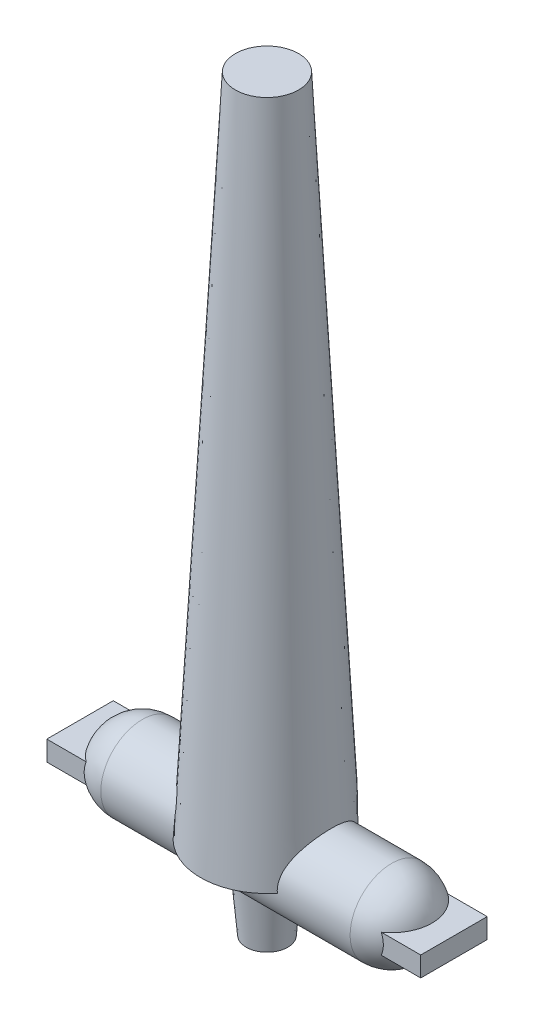
ISO-10303-21;
HEADER;
FILE_DESCRIPTION(('STEP AP214'),'2;1');
FILE_NAME('part.step','',(''),(''),'','','');
FILE_SCHEMA(('AUTOMOTIVE_DESIGN { 1 0 10303 214 1 1 1 1 }'));
ENDSEC;
DATA;
#1=APPLICATION_CONTEXT('core data for automotive mechanical design processes');
#2=APPLICATION_PROTOCOL_DEFINITION('international standard','automotive_design',2000,#1);
#3=PRODUCT_CONTEXT('',#1,'mechanical');
#4=PRODUCT('Part','Part','',(#3));
#5=PRODUCT_RELATED_PRODUCT_CATEGORY('part','',(#4));
#6=PRODUCT_DEFINITION_FORMATION('','',#4);
#7=PRODUCT_DEFINITION_CONTEXT('part definition',#1,'design');
#8=PRODUCT_DEFINITION('design','',#6,#7);
#9=PRODUCT_DEFINITION_SHAPE('','',#8);
#10=(LENGTH_UNIT() NAMED_UNIT(*) SI_UNIT(.MILLI.,.METRE.));
#11=(NAMED_UNIT(*) PLANE_ANGLE_UNIT() SI_UNIT($,.RADIAN.));
#12=(NAMED_UNIT(*) SI_UNIT($,.STERADIAN.) SOLID_ANGLE_UNIT());
#13=UNCERTAINTY_MEASURE_WITH_UNIT(LENGTH_MEASURE(1.E-05),#10,'distance_accuracy_value','');
#14=(GEOMETRIC_REPRESENTATION_CONTEXT(3) GLOBAL_UNCERTAINTY_ASSIGNED_CONTEXT((#13)) GLOBAL_UNIT_ASSIGNED_CONTEXT((#10,
#11,#12)) REPRESENTATION_CONTEXT('',''));
#15=CARTESIAN_POINT('',(0.,0.,0.));
#16=DIRECTION('',(0.,0.,1.));
#17=DIRECTION('',(1.,0.,0.));
#18=AXIS2_PLACEMENT_3D('',#15,#16,#17);
#19=CARTESIAN_POINT('',(-9.525,0.,0.));
#20=DIRECTION('',(1.,0.,0.));
#21=DIRECTION('',(0.,0.,-1.));
#22=AXIS2_PLACEMENT_3D('',#19,#20,#21);
#23=SPHERICAL_SURFACE('',#22,3.175);
#24=CARTESIAN_POINT('',(-9.525,0.,0.));
#25=DIRECTION('',(-1.,0.,0.));
#26=DIRECTION('',(0.,0.,1.));
#27=AXIS2_PLACEMENT_3D('',#24,#25,#26);
#28=CIRCLE('',#27,3.175);
#29=CARTESIAN_POINT('',(-9.525,0.,3.175));
#30=VERTEX_POINT('',#29);
#31=EDGE_CURVE('E254',#30,#30,#28,.F.);
#32=ORIENTED_EDGE('',*,*,#31,.F.);
#33=EDGE_LOOP('',(#32));
#34=FACE_BOUND('',#33,.T.);
#35=CARTESIAN_POINT('',(-9.525,0.762,0.));
#36=DIRECTION('',(0.,-1.,0.));
#37=DIRECTION('',(0.,0.,-1.));
#38=AXIS2_PLACEMENT_3D('',#35,#36,#37);
#39=CIRCLE('',#38,3.08220391927595);
#40=CARTESIAN_POINT('',(-11.2709613397782,0.762,-2.54));
#41=VERTEX_POINT('',#40);
#42=CARTESIAN_POINT('',(-11.2709613397782,0.762,2.54));
#43=VERTEX_POINT('',#42);
#44=EDGE_CURVE('E141',#41,#43,#39,.F.);
#45=ORIENTED_EDGE('',*,*,#44,.T.);
#46=CARTESIAN_POINT('',(-9.525,0.,2.54));
#47=DIRECTION('',(0.,0.,-1.));
#48=DIRECTION('',(-1.,0.,0.));
#49=AXIS2_PLACEMENT_3D('',#46,#47,#48);
#50=CIRCLE('',#49,1.905);
#51=CARTESIAN_POINT('',(-11.2709613397782,-0.762,2.54));
#52=VERTEX_POINT('',#51);
#53=EDGE_CURVE('E155',#43,#52,#50,.F.);
#54=ORIENTED_EDGE('',*,*,#53,.T.);
#55=CARTESIAN_POINT('',(-9.525,-0.762,0.));
#56=DIRECTION('',(0.,1.,0.));
#57=DIRECTION('',(0.,0.,1.));
#58=AXIS2_PLACEMENT_3D('',#55,#56,#57);
#59=CIRCLE('',#58,3.08220391927595);
#60=CARTESIAN_POINT('',(-11.2709613397782,-0.762,-2.54));
#61=VERTEX_POINT('',#60);
#62=EDGE_CURVE('E152',#52,#61,#59,.F.);
#63=ORIENTED_EDGE('',*,*,#62,.T.);
#64=CARTESIAN_POINT('',(-9.525,0.,-2.54));
#65=DIRECTION('',(0.,0.,1.));
#66=DIRECTION('',(1.,0.,0.));
#67=AXIS2_PLACEMENT_3D('',#64,#65,#66);
#68=CIRCLE('',#67,1.905);
#69=EDGE_CURVE('E145',#61,#41,#68,.F.);
#70=ORIENTED_EDGE('',*,*,#69,.T.);
#71=EDGE_LOOP('',(#45,#54,#63,#70));
#72=FACE_BOUND('',#71,.T.);
#73=ADVANCED_FACE('F35',(#34,#72),#23,.T.);
#74=CARTESIAN_POINT('',(9.525,0.,0.));
#75=DIRECTION('',(1.,0.,0.));
#76=DIRECTION('',(0.,0.,-1.));
#77=AXIS2_PLACEMENT_3D('',#74,#75,#76);
#78=SPHERICAL_SURFACE('',#77,3.175);
#79=CARTESIAN_POINT('',(9.525,0.,0.));
#80=DIRECTION('',(-1.,0.,0.));
#81=DIRECTION('',(0.,0.,1.));
#82=AXIS2_PLACEMENT_3D('',#79,#80,#81);
#83=CIRCLE('',#82,3.175);
#84=CARTESIAN_POINT('',(9.525,0.,3.175));
#85=VERTEX_POINT('',#84);
#86=EDGE_CURVE('E252',#85,#85,#83,.T.);
#87=ORIENTED_EDGE('',*,*,#86,.F.);
#88=EDGE_LOOP('',(#87));
#89=FACE_BOUND('',#88,.T.);
#90=CARTESIAN_POINT('',(9.525,-0.762,0.));
#91=DIRECTION('',(0.,1.,0.));
#92=DIRECTION('',(0.,0.,1.));
#93=AXIS2_PLACEMENT_3D('',#90,#91,#92);
#94=CIRCLE('',#93,3.08220391927595);
#95=CARTESIAN_POINT('',(11.2709613397782,-0.762,-2.54));
#96=VERTEX_POINT('',#95);
#97=CARTESIAN_POINT('',(11.2709613397782,-0.762,2.54));
#98=VERTEX_POINT('',#97);
#99=EDGE_CURVE('E49',#96,#98,#94,.F.);
#100=ORIENTED_EDGE('',*,*,#99,.T.);
#101=CARTESIAN_POINT('',(9.525,0.,2.54));
#102=DIRECTION('',(0.,0.,-1.));
#103=DIRECTION('',(-1.,0.,0.));
#104=AXIS2_PLACEMENT_3D('',#101,#102,#103);
#105=CIRCLE('',#104,1.905);
#106=CARTESIAN_POINT('',(11.2709613397782,0.762,2.54));
#107=VERTEX_POINT('',#106);
#108=EDGE_CURVE('E11',#98,#107,#105,.F.);
#109=ORIENTED_EDGE('',*,*,#108,.T.);
#110=CARTESIAN_POINT('',(9.525,0.762,0.));
#111=DIRECTION('',(0.,-1.,0.));
#112=DIRECTION('',(0.,0.,-1.));
#113=AXIS2_PLACEMENT_3D('',#110,#111,#112);
#114=CIRCLE('',#113,3.08220391927595);
#115=CARTESIAN_POINT('',(11.2709613397782,0.762,-2.54));
#116=VERTEX_POINT('',#115);
#117=EDGE_CURVE('E258',#107,#116,#114,.F.);
#118=ORIENTED_EDGE('',*,*,#117,.T.);
#119=CARTESIAN_POINT('',(9.525,0.,-2.54));
#120=DIRECTION('',(0.,0.,1.));
#121=DIRECTION('',(1.,0.,0.));
#122=AXIS2_PLACEMENT_3D('',#119,#120,#121);
#123=CIRCLE('',#122,1.905);
#124=EDGE_CURVE('E263',#116,#96,#123,.F.);
#125=ORIENTED_EDGE('',*,*,#124,.T.);
#126=EDGE_LOOP('',(#100,#109,#118,#125));
#127=FACE_BOUND('',#126,.T.);
#128=ADVANCED_FACE('F226',(#89,#127),#78,.T.);
#129=CARTESIAN_POINT('',(0.,0.,0.));
#130=DIRECTION('',(0.,1.,0.));
#131=DIRECTION('',(-1.,0.,0.));
#132=AXIS2_PLACEMENT_3D('',#129,#130,#131);
#133=PLANE('',#132);
#134=DIRECTION('',(-1.,0.,0.));
#135=VECTOR('',#134,1.);
#136=CARTESIAN_POINT('',(12.7,0.,-3.175));
#137=LINE('',#136,#135);
#138=CARTESIAN_POINT('',(-3.95957058950354,0.,-3.175));
#139=VERTEX_POINT('',#138);
#140=CARTESIAN_POINT('',(3.95957058950355,0.,-3.175));
#141=VERTEX_POINT('',#140);
#142=EDGE_CURVE('E161',#139,#141,#137,.F.);
#143=ORIENTED_EDGE('',*,*,#142,.F.);
#144=CARTESIAN_POINT('',(0.,0.,0.));
#145=DIRECTION('',(0.,1.,0.));
#146=DIRECTION('',(-1.,0.,0.));
#147=AXIS2_PLACEMENT_3D('',#144,#145,#146);
#148=CIRCLE('',#147,5.07531518757815);
#149=EDGE_CURVE('E167',#141,#139,#148,.T.);
#150=ORIENTED_EDGE('',*,*,#149,.F.);
#151=EDGE_LOOP('',(#143,#150));
#152=FACE_BOUND('',#151,.T.);
#153=ADVANCED_FACE('F232',(#152),#133,.F.);
#154=DIRECTION('',(-1.,0.,0.));
#155=VECTOR('',#154,1.);
#156=CARTESIAN_POINT('',(12.7,0.,3.175));
#157=LINE('',#156,#155);
#158=CARTESIAN_POINT('',(3.95957058950355,0.,3.175));
#159=VERTEX_POINT('',#158);
#160=CARTESIAN_POINT('',(-3.95957058950355,0.,3.175));
#161=VERTEX_POINT('',#160);
#162=EDGE_CURVE('E158',#159,#161,#157,.T.);
#163=ORIENTED_EDGE('',*,*,#162,.F.);
#164=EDGE_CURVE('E168',#161,#159,#148,.T.);
#165=ORIENTED_EDGE('',*,*,#164,.F.);
#166=EDGE_LOOP('',(#163,#165));
#167=FACE_BOUND('',#166,.T.);
#168=ADVANCED_FACE('F240',(#167),#133,.F.);
#169=CARTESIAN_POINT('',(0.,0.,0.));
#170=DIRECTION('',(0.,-1.,0.));
#171=DIRECTION('',(1.,0.,0.));
#172=AXIS2_PLACEMENT_3D('',#169,#170,#171);
#173=CONICAL_SURFACE('',#172,5.07531518757815,0.0523598775598232);
#174=CARTESIAN_POINT('',(0.,50.8,0.));
#175=DIRECTION('',(0.,1.,0.));
#176=DIRECTION('',(-1.,0.,0.));
#177=AXIS2_PLACEMENT_3D('',#174,#175,#176);
#178=CIRCLE('',#177,2.413);
#179=CARTESIAN_POINT('',(-2.41300000000001,50.8,0.));
#180=VERTEX_POINT('',#179);
#181=EDGE_CURVE('E164',#180,#180,#178,.T.);
#182=ORIENTED_EDGE('',*,*,#181,.F.);
#183=EDGE_LOOP('',(#182));
#184=FACE_BOUND('',#183,.T.);
#185=CARTESIAN_POINT('',(3.95958402963879,-0.000199999999999678,-3.17499999370079));
#186=CARTESIAN_POINT('',(3.95438967188204,0.0765411431737697,-3.17502304496552));
#187=CARTESIAN_POINT('',(3.95148212424688,0.153428063232889,-3.17222795595932));
#188=CARTESIAN_POINT('',(3.95013382546557,0.306778848984278,-3.16107368285523));
#189=CARTESIAN_POINT('',(3.95168966353041,0.38324299300147,-3.15271875117481));
#190=CARTESIAN_POINT('',(3.95912222586376,0.534512182563147,-3.1306104415757));
#191=CARTESIAN_POINT('',(3.96496239191473,0.609325782310477,-3.11690319507564));
#192=CARTESIAN_POINT('',(3.98058377086054,0.757374162166089,-3.08427663329336));
#193=CARTESIAN_POINT('',(3.99036547168958,0.830608745620367,-3.06535667280567));
#194=CARTESIAN_POINT('',(4.02491226161872,1.04678551511115,-3.00122760185701));
#195=CARTESIAN_POINT('',(4.05491205496967,1.1867589507922,-2.94856572532458));
#196=CARTESIAN_POINT('',(4.12462875971551,1.45611367585722,-2.8253172596042));
#197=CARTESIAN_POINT('',(4.1643672381392,1.58547059361887,-2.75469087335528));
#198=CARTESIAN_POINT('',(4.25371061687455,1.84513199879935,-2.58887568790184));
#199=CARTESIAN_POINT('',(4.30391550579833,1.9740713703324,-2.491872471407));
#200=CARTESIAN_POINT('',(4.40564890040013,2.21556362234025,-2.27986292308631));
#201=CARTESIAN_POINT('',(4.45717802395976,2.32810868378513,-2.16484805477266));
#202=CARTESIAN_POINT('',(4.56481587775618,2.55143519234624,-1.89879071636404));
#203=CARTESIAN_POINT('',(4.62038061582506,2.65918852011727,-1.74492690440523));
#204=CARTESIAN_POINT('',(4.69558642922645,2.79997521033561,-1.49989028994792));
#205=CARTESIAN_POINT('',(4.71930717450259,2.84344539597335,-1.41579602898411));
#206=CARTESIAN_POINT('',(4.76333507469678,2.92296767892244,-1.2433354587784));
#207=CARTESIAN_POINT('',(4.78364433121635,2.95902434632147,-1.15497182315342));
#208=CARTESIAN_POINT('',(4.81901905970936,3.02116933796405,-0.980401886625061));
#209=CARTESIAN_POINT('',(4.83433755693982,3.0477491827692,-0.894421572977776));
#210=CARTESIAN_POINT('',(4.86094861342633,3.09360607819334,-0.719968578963215));
#211=CARTESIAN_POINT('',(4.87224338396214,3.11288714029816,-0.631497296469926));
#212=CARTESIAN_POINT('',(4.890451766848,3.14384636941616,-0.45283927784061));
#213=CARTESIAN_POINT('',(4.89736823583319,3.15552949386147,-0.362653699853515));
#214=CARTESIAN_POINT('',(4.90661180672002,3.17111989561792,-0.181412012151531));
#215=CARTESIAN_POINT('',(4.9089394892851,3.17502815675811,-0.0903560140447589));
#216=CARTESIAN_POINT('',(4.90888736331115,3.17495088469231,0.158884036698038));
#217=CARTESIAN_POINT('',(4.9017832173828,3.16304056421882,0.317160132098365));
#218=CARTESIAN_POINT('',(4.87410052595546,3.1160880920046,0.628907161101296));
#219=CARTESIAN_POINT('',(4.85352151256968,3.08104513703087,0.782377927654942));
#220=CARTESIAN_POINT('',(4.80115214594288,2.99003217404695,1.07894507134926));
#221=CARTESIAN_POINT('',(4.76949122440707,2.93430333182431,1.22213915089913));
#222=CARTESIAN_POINT('',(4.69758424508942,2.80394155338164,1.49724417058449));
#223=CARTESIAN_POINT('',(4.65733662369994,2.72930517370146,1.62915304958757));
#224=CARTESIAN_POINT('',(4.5664977450158,2.55374306462921,1.89394029295859));
#225=CARTESIAN_POINT('',(4.51525224089266,2.45080460828191,2.02525888198637));
#226=CARTESIAN_POINT('',(4.41057961433566,2.22611541760719,2.26996163986695));
#227=CARTESIAN_POINT('',(4.35714890020181,2.10433271425352,2.38331465625206));
#228=CARTESIAN_POINT('',(4.24718924280843,1.82801538331994,2.60261709827394));
#229=CARTESIAN_POINT('',(4.19104824870274,1.67130783923893,2.7060802828239));
#230=CARTESIAN_POINT('',(4.1163492804085,1.42251884278257,2.84005680812368));
#231=CARTESIAN_POINT('',(4.09305597337501,1.33740492067221,2.8811448494014));
#232=CARTESIAN_POINT('',(4.05075034589058,1.16296930496263,2.95586026953453));
#233=CARTESIAN_POINT('',(4.03173456493829,1.07365108388443,2.98949367883136));
#234=CARTESIAN_POINT('',(4.00145701947272,0.904620945451952,3.04450419998132));
#235=CARTESIAN_POINT('',(3.98947195746218,0.825385160908447,3.06694995643198));
#236=CARTESIAN_POINT('',(3.97006586868877,0.664887255362265,3.10569843191475));
#237=CARTESIAN_POINT('',(3.96264344970475,0.58362576035743,3.12200302424106));
#238=CARTESIAN_POINT('',(3.95278302640554,0.418891835527063,3.14836052057205));
#239=CARTESIAN_POINT('',(3.95039933405645,0.335405040547957,3.15834449932385));
#240=CARTESIAN_POINT('',(3.95095019415002,0.16782159606093,3.17168417933479));
#241=CARTESIAN_POINT('',(3.95389118743657,0.083724330687586,3.17503184291454));
#242=CARTESIAN_POINT('',(3.9595840296388,-0.000200000000000526,3.17499999370079));
#243=B_SPLINE_CURVE_WITH_KNOTS('',3,(#185,#186,#187,#188,#189,#190,#191,#192,#193,#194,#195,
#196,#197,#198,#199,#200,#201,#202,#203,#204,#205,#206,#207,#208,#209,#210,#211,#212,#213,#214,
#215,#216,#217,#218,#219,#220,#221,#222,#223,#224,#225,#226,#227,#228,#229,#230,#231,#232,#233,
#234,#235,#236,#237,#238,#239,#240,#241,#242),.UNSPECIFIED.,.F.,.F.,(4,2,2,2,2,2,2,2,2,2,2,2,2,
2,2,2,2,2,2,2,2,2,2,2,2,2,2,2,4),(0.,0.230651135850007,0.461126061798982,0.689656886908396,
0.918216011216954,1.37366042206971,1.83012270962805,2.33517821415411,2.84047381445324,
3.4247884857064,3.71721460475486,4.0094599126792,4.28293400841826,4.55625758100703,
4.82940263855881,5.10251313021113,5.57659021841054,6.05068376882464,6.519415359173,
6.98823237684766,7.50978103178891,8.03222438946505,8.61683883678991,8.90848900084041,
9.19990236567873,9.44921986418247,9.69846124943,9.95037576551349,10.2025952059368),.UNSPECIFIED.);
#244=EDGE_CURVE('E179',#141,#159,#243,.T.);
#245=ORIENTED_EDGE('',*,*,#244,.F.);
#246=ORIENTED_EDGE('',*,*,#149,.T.);
#247=CARTESIAN_POINT('',(-3.95958402963879,-0.000199999999999682,3.17499999370079));
#248=CARTESIAN_POINT('',(-3.95438967188204,0.0765411431737698,3.17502304496552));
#249=CARTESIAN_POINT('',(-3.95148212424688,0.15342806323289,3.17222795595932));
#250=CARTESIAN_POINT('',(-3.95013382546557,0.306778848984278,3.16107368285523));
#251=CARTESIAN_POINT('',(-3.95168966353041,0.38324299300147,3.15271875117481));
#252=CARTESIAN_POINT('',(-3.95912222586376,0.534512182563147,3.1306104415757));
#253=CARTESIAN_POINT('',(-3.96496239191473,0.609325782310477,3.11690319507564));
#254=CARTESIAN_POINT('',(-3.98058377086054,0.75737416216609,3.08427663329336));
#255=CARTESIAN_POINT('',(-3.99036547168959,0.830608745620367,3.06535667280567));
#256=CARTESIAN_POINT('',(-4.02491226161872,1.04678551511115,3.00122760185701));
#257=CARTESIAN_POINT('',(-4.05491205496967,1.1867589507922,2.94856572532458));
#258=CARTESIAN_POINT('',(-4.12462875971551,1.45611367585722,2.8253172596042));
#259=CARTESIAN_POINT('',(-4.1643672381392,1.58547059361887,2.75469087335528));
#260=CARTESIAN_POINT('',(-4.25371061687455,1.84513199879935,2.58887568790183));
#261=CARTESIAN_POINT('',(-4.30391550579833,1.9740713703324,2.491872471407));
#262=CARTESIAN_POINT('',(-4.40564890040013,2.21556362234026,2.27986292308631));
#263=CARTESIAN_POINT('',(-4.45717802395976,2.32810868378513,2.16484805477266));
#264=CARTESIAN_POINT('',(-4.56481587775618,2.55143519234624,1.89879071636404));
#265=CARTESIAN_POINT('',(-4.62038061582506,2.65918852011727,1.74492690440523));
#266=CARTESIAN_POINT('',(-4.69558642922645,2.79997521033561,1.49989028994792));
#267=CARTESIAN_POINT('',(-4.71930717450259,2.84344539597335,1.41579602898411));
#268=CARTESIAN_POINT('',(-4.76333507469678,2.92296767892244,1.2433354587784));
#269=CARTESIAN_POINT('',(-4.78364433121635,2.95902434632147,1.15497182315342));
#270=CARTESIAN_POINT('',(-4.81901905970936,3.02116933796405,0.980401886625059));
#271=CARTESIAN_POINT('',(-4.83433755693982,3.0477491827692,0.894421572977774));
#272=CARTESIAN_POINT('',(-4.86094861342633,3.09360607819334,0.719968578963213));
#273=CARTESIAN_POINT('',(-4.87224338396214,3.11288714029816,0.631497296469924));
#274=CARTESIAN_POINT('',(-4.890451766848,3.14384636941616,0.452839277840608));
#275=CARTESIAN_POINT('',(-4.89736823583319,3.15552949386148,0.362653699853513));
#276=CARTESIAN_POINT('',(-4.90661180672002,3.17111989561792,0.181412012151529));
#277=CARTESIAN_POINT('',(-4.9089394892851,3.17502815675811,0.0903560140447568));
#278=CARTESIAN_POINT('',(-4.90888736331115,3.17495088469231,-0.15888403669804));
#279=CARTESIAN_POINT('',(-4.9017832173828,3.16304056421882,-0.317160132098367));
#280=CARTESIAN_POINT('',(-4.87410052595545,3.1160880920046,-0.628907161101297));
#281=CARTESIAN_POINT('',(-4.85352151256968,3.08104513703087,-0.782377927654943));
#282=CARTESIAN_POINT('',(-4.80115214594288,2.99003217404695,-1.07894507134926));
#283=CARTESIAN_POINT('',(-4.76949122440707,2.93430333182431,-1.22213915089913));
#284=CARTESIAN_POINT('',(-4.69758424508942,2.80394155338164,-1.49724417058449));
#285=CARTESIAN_POINT('',(-4.65733662369994,2.72930517370146,-1.62915304958757));
#286=CARTESIAN_POINT('',(-4.5664977450158,2.55374306462921,-1.89394029295859));
#287=CARTESIAN_POINT('',(-4.51525224089266,2.45080460828191,-2.02525888198638));
#288=CARTESIAN_POINT('',(-4.41057961433566,2.22611541760719,-2.26996163986695));
#289=CARTESIAN_POINT('',(-4.35714890020181,2.10433271425351,-2.38331465625207));
#290=CARTESIAN_POINT('',(-4.24718924280843,1.82801538331994,-2.60261709827394));
#291=CARTESIAN_POINT('',(-4.19104824870274,1.67130783923893,-2.7060802828239));
#292=CARTESIAN_POINT('',(-4.1163492804085,1.42251884278256,-2.84005680812368));
#293=CARTESIAN_POINT('',(-4.09305597337501,1.33740492067221,-2.8811448494014));
#294=CARTESIAN_POINT('',(-4.05075034589058,1.16296930496263,-2.95586026953454));
#295=CARTESIAN_POINT('',(-4.03173456493829,1.07365108388443,-2.98949367883136));
#296=CARTESIAN_POINT('',(-4.00145701947272,0.904620945451951,-3.04450419998132));
#297=CARTESIAN_POINT('',(-3.98947195746217,0.825385160908446,-3.06694995643198));
#298=CARTESIAN_POINT('',(-3.97006586868876,0.664887255362264,-3.10569843191475));
#299=CARTESIAN_POINT('',(-3.96264344970475,0.58362576035743,-3.12200302424106));
#300=CARTESIAN_POINT('',(-3.95278302640554,0.418891835527062,-3.14836052057205));
#301=CARTESIAN_POINT('',(-3.95039933405645,0.335405040547955,-3.15834449932385));
#302=CARTESIAN_POINT('',(-3.95095019415002,0.167821596060928,-3.17168417933478));
#303=CARTESIAN_POINT('',(-3.95389118743657,0.0837243306875851,-3.17503184291454));
#304=CARTESIAN_POINT('',(-3.9595840296388,-0.000200000000000726,-3.17499999370079));
#305=B_SPLINE_CURVE_WITH_KNOTS('',3,(#247,#248,#249,#250,#251,#252,#253,#254,#255,#256,#257,
#258,#259,#260,#261,#262,#263,#264,#265,#266,#267,#268,#269,#270,#271,#272,#273,#274,#275,#276,
#277,#278,#279,#280,#281,#282,#283,#284,#285,#286,#287,#288,#289,#290,#291,#292,#293,#294,#295,
#296,#297,#298,#299,#300,#301,#302,#303,#304),.UNSPECIFIED.,.F.,.F.,(4,2,2,2,2,2,2,2,2,2,2,2,2,
2,2,2,2,2,2,2,2,2,2,2,2,2,2,2,4),(0.,0.230651135850007,0.461126061798982,0.689656886908397,
0.918216011216955,1.37366042206971,1.83012270962806,2.33517821415411,2.84047381445325,
3.4247884857064,3.71721460475487,4.0094599126792,4.28293400841826,4.55625758100703,
4.82940263855881,5.10251313021113,5.57659021841054,6.05068376882464,6.51941535917301,
6.98823237684766,7.50978103178891,8.03222438946505,8.61683883678991,8.90848900084041,
9.19990236567873,9.44921986418246,9.69846124943,9.95037576551349,10.2025952059368),.UNSPECIFIED.);
#306=EDGE_CURVE('E171',#161,#139,#305,.T.);
#307=ORIENTED_EDGE('',*,*,#306,.F.);
#308=ORIENTED_EDGE('',*,*,#164,.T.);
#309=EDGE_LOOP('',(#245,#246,#307,#308));
#310=FACE_BOUND('',#309,.T.);
#311=ADVANCED_FACE('F185',(#184,#310),#173,.T.);
#312=CARTESIAN_POINT('',(2.41299999999999,50.8,0.));
#313=DIRECTION('',(0.,-1.,0.));
#314=DIRECTION('',(1.,0.,0.));
#315=AXIS2_PLACEMENT_3D('',#312,#313,#314);
#316=PLANE('',#315);
#317=ORIENTED_EDGE('',*,*,#181,.T.);
#318=EDGE_LOOP('',(#317));
#319=FACE_BOUND('',#318,.T.);
#320=ADVANCED_FACE('F192',(#319),#316,.F.);
#321=CARTESIAN_POINT('',(12.7,0.,0.));
#322=DIRECTION('',(-1.,0.,0.));
#323=DIRECTION('',(0.,0.,1.));
#324=AXIS2_PLACEMENT_3D('',#321,#322,#323);
#325=CYLINDRICAL_SURFACE('',#324,3.175);
#326=CARTESIAN_POINT('',(-0.234001925464579,-2.53877433127469,-1.90663313064176));
#327=CARTESIAN_POINT('',(-0.33107848560626,-2.5483503587885,-1.89387801968652));
#328=CARTESIAN_POINT('',(-0.426502120375879,-2.56375552964603,-1.87322370658348));
#329=CARTESIAN_POINT('',(-0.611202294426174,-2.6033982236794,-1.81771411857091));
#330=CARTESIAN_POINT('',(-0.700468293927782,-2.62765046478789,-1.78283516816741));
#331=CARTESIAN_POINT('',(-0.87042123321988,-2.68133612866261,-1.70100777781526));
#332=CARTESIAN_POINT('',(-0.951177824131807,-2.71072122193132,-1.65417018817762));
#333=CARTESIAN_POINT('',(-1.10425206238241,-2.771820385309,-1.54961468672158));
#334=CARTESIAN_POINT('',(-1.17657008449027,-2.8035343518873,-1.49189725839072));
#335=CARTESIAN_POINT('',(-1.32333817761362,-2.87195122165498,-1.35617136624498));
#336=CARTESIAN_POINT('',(-1.39617451338769,-2.90861472670423,-1.27638643095079));
#337=CARTESIAN_POINT('',(-1.52817598865755,-2.97808486930918,-1.10463601312034));
#338=CARTESIAN_POINT('',(-1.58733498654155,-3.01088977097921,-1.01266508768693));
#339=CARTESIAN_POINT('',(-1.69134124578334,-3.07015221429537,-0.815840825200661));
#340=CARTESIAN_POINT('',(-1.73579988610752,-3.09643341119308,-0.710725873423208));
#341=CARTESIAN_POINT('',(-1.80602162275115,-3.13853103879402,-0.492485847457639));
#342=CARTESIAN_POINT('',(-1.83180919375955,-3.15436116671304,-0.379371473597074));
#343=CARTESIAN_POINT('',(-1.86104045331045,-3.17236062837623,-0.164045206497458));
#344=CARTESIAN_POINT('',(-1.86691513635641,-3.17601520414363,-0.0622836095635708));
#345=CARTESIAN_POINT('',(-1.86285422940401,-3.1734994979334,0.140788744263055));
#346=CARTESIAN_POINT('',(-1.85292310800848,-3.16733199284532,0.242099620463321));
#347=CARTESIAN_POINT('',(-1.81906878194996,-3.14657543350596,0.434005947128862));
#348=CARTESIAN_POINT('',(-1.79617366211257,-3.13260609428742,0.524855059399785));
#349=CARTESIAN_POINT('',(-1.7382204342496,-3.09790840680287,0.701191046374612));
#350=CARTESIAN_POINT('',(-1.70316086357936,-3.07717924575887,0.786677274789078));
#351=CARTESIAN_POINT('',(-1.61931281062627,-3.02893623704834,0.956276417005184));
#352=CARTESIAN_POINT('',(-1.56975407580469,-3.00105741258697,1.03990239259076));
#353=CARTESIAN_POINT('',(-1.45945501270129,-2.94153202490291,1.19798294877365));
#354=CARTESIAN_POINT('',(-1.39870425315574,-2.90988195658264,1.27242886435352));
#355=CARTESIAN_POINT('',(-1.25846582143211,-2.84095337017622,1.42024492148248));
#356=CARTESIAN_POINT('',(-1.17756509348805,-2.80348168988653,1.49218873081068));
#357=CARTESIAN_POINT('',(-1.00399445302985,-2.73068842330667,1.62156481746177));
#358=CARTESIAN_POINT('',(-0.911329144928434,-2.69536600379827,1.67900274593646));
#359=CARTESIAN_POINT('',(-0.734824412686644,-2.63786278346277,1.76763326673961));
#360=CARTESIAN_POINT('',(-0.652866734175206,-2.61446461412454,1.80177018834209));
#361=CARTESIAN_POINT('',(-0.483318638261935,-2.5747925089734,1.85802632113556));
#362=CARTESIAN_POINT('',(-0.39573674861736,-2.55850806639723,1.88016326766377));
#363=CARTESIAN_POINT('',(-0.216231580346622,-2.53540778940361,1.91121136149995));
#364=CARTESIAN_POINT('',(-0.124279400249398,-2.52866800525828,1.9200163196604));
#365=CARTESIAN_POINT('',(0.0600232627903229,-2.52616400287021,1.92331210328469));
#366=CARTESIAN_POINT('',(0.152373611191024,-2.53039632913659,1.91780743533517));
#367=CARTESIAN_POINT('',(0.323275843776321,-2.54790224945605,1.89446130373319));
#368=CARTESIAN_POINT('',(0.402167166785587,-2.56004642416129,1.87815714384186));
#369=CARTESIAN_POINT('',(0.55598303401868,-2.59064823121359,1.83571476668342));
#370=CARTESIAN_POINT('',(0.630904044788655,-2.60911138178977,1.80956795203186));
#371=CARTESIAN_POINT('',(0.80169516353001,-2.65788644914724,1.73745913086298));
#372=CARTESIAN_POINT('',(0.895449090232362,-2.69007333242824,1.68775390990812));
#373=CARTESIAN_POINT('',(1.07239033572695,-2.75813616872911,1.57407276400251));
#374=CARTESIAN_POINT('',(1.15556261546975,-2.79401724397681,1.51007687653369));
#375=CARTESIAN_POINT('',(1.31121678641165,-2.86606010704989,1.3684687959731));
#376=CARTESIAN_POINT('',(1.38356483325108,-2.9022203818851,1.2907085700271));
#377=CARTESIAN_POINT('',(1.51508932658585,-2.97099899223559,1.1233739026842));
#378=CARTESIAN_POINT('',(1.57426966740587,-3.00361837349808,1.03380296679726));
#379=CARTESIAN_POINT('',(1.68009085275972,-3.06359937397613,0.840066736906362));
#380=CARTESIAN_POINT('',(1.72604117727403,-3.09065540266396,0.735423750975347));
#381=CARTESIAN_POINT('',(1.79931467314793,-3.13445211693943,0.51778672082029));
#382=CARTESIAN_POINT('',(1.82665820688157,-3.15120407686665,0.40480195607873));
#383=CARTESIAN_POINT('',(1.85880743630034,-3.17097596049744,0.18912055770531));
#384=CARTESIAN_POINT('',(1.86601076833946,-3.17545528876991,0.0869120773167815));
#385=CARTESIAN_POINT('',(1.86442471634479,-3.17447192414927,-0.117316053562538));
#386=CARTESIAN_POINT('',(1.85564103366009,-3.16901277555288,-0.219335758387529));
#387=CARTESIAN_POINT('',(1.82385591786466,-3.14950042694314,-0.412284662457522));
#388=CARTESIAN_POINT('',(1.8019704527829,-3.13612262696568,-0.503471726792616));
#389=CARTESIAN_POINT('',(1.74594691978414,-3.10249845439036,-0.680634267191786));
#390=CARTESIAN_POINT('',(1.71180738860561,-3.08225126153217,-0.766609119430397));
#391=CARTESIAN_POINT('',(1.62994773935782,-3.03497321575408,-0.936944366543848));
#392=CARTESIAN_POINT('',(1.58150524786239,-3.00759430623647,-1.0208587280339));
#393=CARTESIAN_POINT('',(1.47344142192887,-2.94892648524716,-1.17967758898385));
#394=CARTESIAN_POINT('',(1.41381023918886,-2.91763413731569,-1.25457405479814));
#395=CARTESIAN_POINT('',(1.2759700530954,-2.8492631776371,-1.403525936561));
#396=CARTESIAN_POINT('',(1.19634953972793,-2.81196452145842,-1.4761778627048));
#397=CARTESIAN_POINT('',(1.0253594992941,-2.73917160595726,-1.60722734837959));
#398=CARTESIAN_POINT('',(0.933993003274677,-2.70367688441568,-1.66562857407091));
#399=CARTESIAN_POINT('',(0.758678629374821,-2.64506693366705,-1.756879090084));
#400=CARTESIAN_POINT('',(0.676519322332135,-2.62087733020609,-1.79246166870883));
#401=CARTESIAN_POINT('',(0.506313940034383,-2.57951006739459,-1.8515019574427));
#402=CARTESIAN_POINT('',(0.418276703268868,-2.56232214437406,-1.87497742873673));
#403=CARTESIAN_POINT('',(0.236336417029879,-2.53726623593321,-1.90876404328878));
#404=CARTESIAN_POINT('',(0.142348257631488,-2.52960508575896,-1.91878339940335));
#405=CARTESIAN_POINT('',(-0.0462674646098143,-2.52576759620464,-1.92383381359515));
#406=CARTESIAN_POINT('',(-0.140894949426032,-2.52958987971427,-1.91886666887534));
#407=CARTESIAN_POINT('',(-0.234001925464579,-2.53877433127469,-1.90663313064176));
#408=B_SPLINE_CURVE_WITH_KNOTS('',3,(#326,#327,#328,#329,#330,#331,#332,#333,#334,#335,#336,
#337,#338,#339,#340,#341,#342,#343,#344,#345,#346,#347,#348,#349,#350,#351,#352,#353,#354,#355,
#356,#357,#358,#359,#360,#361,#362,#363,#364,#365,#366,#367,#368,#369,#370,#371,#372,#373,#374,
#375,#376,#377,#378,#379,#380,#381,#382,#383,#384,#385,#386,#387,#388,#389,#390,#391,#392,#393,
#394,#395,#396,#397,#398,#399,#400,#401,#402,#403,#404,#405,#406,#407),.UNSPECIFIED.,.T.,.F.,(4,
2,2,2,2,2,2,2,2,2,2,2,2,2,2,2,2,2,2,2,2,2,2,2,2,2,2,2,2,2,2,2,2,2,2,2,2,2,2,2,4),(0.,
0.294685892284722,0.58986427473082,0.882400008675951,1.17492274573241,1.51566682482292,
1.85656361424763,2.20586134062639,2.55470036228928,2.85903234594043,3.16327830440961,
3.4462275105478,3.72921075008791,4.03139903685236,4.33387040922837,4.67608058902189,
5.01815724536563,5.29254668520947,5.5665294783808,5.84268326964538,6.11875010125143,
6.36214155670969,6.60574610546696,6.93666367026696,7.26804641541,7.60323757354008,
7.93832946734897,8.28862044021852,8.63852745238738,8.94452548363386,9.25041441009695,
9.53335716733676,9.81633372209768,10.1172078911505,10.4183481430977,10.7590555311745,
11.0996751756386,11.3768432736477,11.6536035997742,11.9362733076623,12.2189091187356),.UNSPECIFIED.);
#409=CARTESIAN_POINT('',(-0.234001925464579,-2.53877433127469,-1.90663313064176));
#410=VERTEX_POINT('',#409);
#411=EDGE_CURVE('E40',#410,#410,#408,.T.);
#412=ORIENTED_EDGE('',*,*,#411,.T.);
#413=EDGE_LOOP('',(#412));
#414=FACE_BOUND('',#413,.T.);
#415=ORIENTED_EDGE('',*,*,#31,.T.);
#416=EDGE_LOOP('',(#415));
#417=FACE_BOUND('',#416,.T.);
#418=ORIENTED_EDGE('',*,*,#86,.T.);
#419=EDGE_LOOP('',(#418));
#420=FACE_BOUND('',#419,.T.);
#421=ORIENTED_EDGE('',*,*,#142,.T.);
#422=ORIENTED_EDGE('',*,*,#244,.T.);
#423=ORIENTED_EDGE('',*,*,#162,.T.);
#424=ORIENTED_EDGE('',*,*,#306,.T.);
#425=EDGE_LOOP('',(#421,#422,#423,#424));
#426=FACE_BOUND('',#425,.T.);
#427=ADVANCED_FACE('F188',(#414,#417,#420,#426),#325,.T.);
#428=CARTESIAN_POINT('',(14.2875,0.,0.));
#429=DIRECTION('',(1.,0.,0.));
#430=DIRECTION('',(0.,0.,-1.));
#431=AXIS2_PLACEMENT_3D('',#428,#429,#430);
#432=PLANE('',#431);
#433=DIRECTION('',(0.,-1.,0.));
#434=VECTOR('',#433,1.);
#435=CARTESIAN_POINT('',(14.2875,0.762,2.54));
#436=LINE('',#435,#434);
#437=CARTESIAN_POINT('',(14.2875,0.762,2.54));
#438=VERTEX_POINT('',#437);
#439=CARTESIAN_POINT('',(14.2875,-0.762,2.54));
#440=VERTEX_POINT('',#439);
#441=EDGE_CURVE('E130',#438,#440,#436,.T.);
#442=ORIENTED_EDGE('',*,*,#441,.T.);
#443=DIRECTION('',(0.,0.,-1.));
#444=VECTOR('',#443,1.);
#445=CARTESIAN_POINT('',(14.2875,-0.762,2.54));
#446=LINE('',#445,#444);
#447=CARTESIAN_POINT('',(14.2875,-0.762,-2.54));
#448=VERTEX_POINT('',#447);
#449=EDGE_CURVE('E119',#440,#448,#446,.T.);
#450=ORIENTED_EDGE('',*,*,#449,.T.);
#451=DIRECTION('',(0.,1.,0.));
#452=VECTOR('',#451,1.);
#453=CARTESIAN_POINT('',(14.2875,0.762,-2.54));
#454=LINE('',#453,#452);
#455=CARTESIAN_POINT('',(14.2875,0.762,-2.54));
#456=VERTEX_POINT('',#455);
#457=EDGE_CURVE('E129',#448,#456,#454,.T.);
#458=ORIENTED_EDGE('',*,*,#457,.T.);
#459=DIRECTION('',(0.,0.,1.));
#460=VECTOR('',#459,1.);
#461=CARTESIAN_POINT('',(14.2875,0.762,2.54));
#462=LINE('',#461,#460);
#463=EDGE_CURVE('E134',#456,#438,#462,.T.);
#464=ORIENTED_EDGE('',*,*,#463,.T.);
#465=EDGE_LOOP('',(#442,#450,#458,#464));
#466=FACE_BOUND('',#465,.T.);
#467=ADVANCED_FACE('F133',(#466),#432,.T.);
#468=CARTESIAN_POINT('',(14.2875,0.762,2.54));
#469=DIRECTION('',(0.,-1.,0.));
#470=DIRECTION('',(0.,0.,-1.));
#471=AXIS2_PLACEMENT_3D('',#468,#469,#470);
#472=PLANE('',#471);
#473=ORIENTED_EDGE('',*,*,#117,.F.);
#474=DIRECTION('',(-1.,0.,0.));
#475=VECTOR('',#474,1.);
#476=CARTESIAN_POINT('',(14.2875,0.762,2.54));
#477=LINE('',#476,#475);
#478=EDGE_CURVE('E273',#438,#107,#477,.T.);
#479=ORIENTED_EDGE('',*,*,#478,.F.);
#480=ORIENTED_EDGE('',*,*,#463,.F.);
#481=DIRECTION('',(-1.,0.,0.));
#482=VECTOR('',#481,1.);
#483=CARTESIAN_POINT('',(14.2875,0.762,-2.54));
#484=LINE('',#483,#482);
#485=EDGE_CURVE('E64',#456,#116,#484,.T.);
#486=ORIENTED_EDGE('',*,*,#485,.T.);
#487=EDGE_LOOP('',(#473,#479,#480,#486));
#488=FACE_BOUND('',#487,.T.);
#489=ADVANCED_FACE('F205',(#488),#472,.F.);
#490=CARTESIAN_POINT('',(14.2875,0.762,-2.54));
#491=DIRECTION('',(0.,0.,1.));
#492=DIRECTION('',(1.,0.,0.));
#493=AXIS2_PLACEMENT_3D('',#490,#491,#492);
#494=PLANE('',#493);
#495=ORIENTED_EDGE('',*,*,#124,.F.);
#496=ORIENTED_EDGE('',*,*,#485,.F.);
#497=ORIENTED_EDGE('',*,*,#457,.F.);
#498=DIRECTION('',(-1.,0.,0.));
#499=VECTOR('',#498,1.);
#500=CARTESIAN_POINT('',(14.2875,-0.762,-2.54));
#501=LINE('',#500,#499);
#502=EDGE_CURVE('E126',#448,#96,#501,.T.);
#503=ORIENTED_EDGE('',*,*,#502,.T.);
#504=EDGE_LOOP('',(#495,#496,#497,#503));
#505=FACE_BOUND('',#504,.T.);
#506=ADVANCED_FACE('F201',(#505),#494,.F.);
#507=CARTESIAN_POINT('',(14.2875,-0.762,2.54));
#508=DIRECTION('',(0.,1.,0.));
#509=DIRECTION('',(0.,0.,1.));
#510=AXIS2_PLACEMENT_3D('',#507,#508,#509);
#511=PLANE('',#510);
#512=ORIENTED_EDGE('',*,*,#99,.F.);
#513=ORIENTED_EDGE('',*,*,#502,.F.);
#514=ORIENTED_EDGE('',*,*,#449,.F.);
#515=DIRECTION('',(-1.,0.,0.));
#516=VECTOR('',#515,1.);
#517=CARTESIAN_POINT('',(14.2875,-0.762,2.54));
#518=LINE('',#517,#516);
#519=EDGE_CURVE('E123',#440,#98,#518,.T.);
#520=ORIENTED_EDGE('',*,*,#519,.T.);
#521=EDGE_LOOP('',(#512,#513,#514,#520));
#522=FACE_BOUND('',#521,.T.);
#523=ADVANCED_FACE('F121',(#522),#511,.F.);
#524=CARTESIAN_POINT('',(14.2875,0.762,2.54));
#525=DIRECTION('',(0.,0.,-1.));
#526=DIRECTION('',(-1.,0.,0.));
#527=AXIS2_PLACEMENT_3D('',#524,#525,#526);
#528=PLANE('',#527);
#529=ORIENTED_EDGE('',*,*,#108,.F.);
#530=ORIENTED_EDGE('',*,*,#519,.F.);
#531=ORIENTED_EDGE('',*,*,#441,.F.);
#532=ORIENTED_EDGE('',*,*,#478,.T.);
#533=EDGE_LOOP('',(#529,#530,#531,#532));
#534=FACE_BOUND('',#533,.T.);
#535=ADVANCED_FACE('F140',(#534),#528,.F.);
#536=ORIENTED_EDGE('',*,*,#53,.F.);
#537=CARTESIAN_POINT('',(-14.2875,0.762,2.54));
#538=VERTEX_POINT('',#537);
#539=EDGE_CURVE('E56',#43,#538,#477,.T.);
#540=ORIENTED_EDGE('',*,*,#539,.T.);
#541=DIRECTION('',(0.,-1.,0.));
#542=VECTOR('',#541,1.);
#543=CARTESIAN_POINT('',(-14.2875,0.762,2.54));
#544=LINE('',#543,#542);
#545=CARTESIAN_POINT('',(-14.2875,-0.762,2.54));
#546=VERTEX_POINT('',#545);
#547=EDGE_CURVE('E281',#538,#546,#544,.T.);
#548=ORIENTED_EDGE('',*,*,#547,.T.);
#549=EDGE_CURVE('E142',#52,#546,#518,.T.);
#550=ORIENTED_EDGE('',*,*,#549,.F.);
#551=EDGE_LOOP('',(#536,#540,#548,#550));
#552=FACE_BOUND('',#551,.T.);
#553=ADVANCED_FACE('F198',(#552),#528,.F.);
#554=ORIENTED_EDGE('',*,*,#62,.F.);
#555=ORIENTED_EDGE('',*,*,#549,.T.);
#556=DIRECTION('',(0.,0.,-1.));
#557=VECTOR('',#556,1.);
#558=CARTESIAN_POINT('',(-14.2875,-0.762,2.54));
#559=LINE('',#558,#557);
#560=CARTESIAN_POINT('',(-14.2875,-0.762,-2.54));
#561=VERTEX_POINT('',#560);
#562=EDGE_CURVE('E279',#546,#561,#559,.T.);
#563=ORIENTED_EDGE('',*,*,#562,.T.);
#564=EDGE_CURVE('E267',#61,#561,#501,.T.);
#565=ORIENTED_EDGE('',*,*,#564,.F.);
#566=EDGE_LOOP('',(#554,#555,#563,#565));
#567=FACE_BOUND('',#566,.T.);
#568=ADVANCED_FACE('F202',(#567),#511,.F.);
#569=ORIENTED_EDGE('',*,*,#69,.F.);
#570=ORIENTED_EDGE('',*,*,#564,.T.);
#571=DIRECTION('',(0.,1.,0.));
#572=VECTOR('',#571,1.);
#573=CARTESIAN_POINT('',(-14.2875,0.762,-2.54));
#574=LINE('',#573,#572);
#575=CARTESIAN_POINT('',(-14.2875,0.762,-2.54));
#576=VERTEX_POINT('',#575);
#577=EDGE_CURVE('E277',#561,#576,#574,.T.);
#578=ORIENTED_EDGE('',*,*,#577,.T.);
#579=EDGE_CURVE('E272',#41,#576,#484,.T.);
#580=ORIENTED_EDGE('',*,*,#579,.F.);
#581=EDGE_LOOP('',(#569,#570,#578,#580));
#582=FACE_BOUND('',#581,.T.);
#583=ADVANCED_FACE('F207',(#582),#494,.F.);
#584=ORIENTED_EDGE('',*,*,#44,.F.);
#585=ORIENTED_EDGE('',*,*,#579,.T.);
#586=DIRECTION('',(0.,0.,1.));
#587=VECTOR('',#586,1.);
#588=CARTESIAN_POINT('',(-14.2875,0.762,2.54));
#589=LINE('',#588,#587);
#590=EDGE_CURVE('E138',#576,#538,#589,.T.);
#591=ORIENTED_EDGE('',*,*,#590,.T.);
#592=ORIENTED_EDGE('',*,*,#539,.F.);
#593=EDGE_LOOP('',(#584,#585,#591,#592));
#594=FACE_BOUND('',#593,.T.);
#595=ADVANCED_FACE('F210',(#594),#472,.F.);
#596=CARTESIAN_POINT('',(-14.2875,0.,0.));
#597=DIRECTION('',(1.,0.,0.));
#598=DIRECTION('',(0.,0.,-1.));
#599=AXIS2_PLACEMENT_3D('',#596,#597,#598);
#600=PLANE('',#599);
#601=ORIENTED_EDGE('',*,*,#547,.F.);
#602=ORIENTED_EDGE('',*,*,#590,.F.);
#603=ORIENTED_EDGE('',*,*,#577,.F.);
#604=ORIENTED_EDGE('',*,*,#562,.F.);
#605=EDGE_LOOP('',(#601,#602,#603,#604));
#606=FACE_BOUND('',#605,.T.);
#607=ADVANCED_FACE('F211',(#606),#600,.F.);
#608=CARTESIAN_POINT('',(0.,-6.35,0.));
#609=DIRECTION('',(0.,1.,0.));
#610=DIRECTION('',(0.,0.,1.));
#611=AXIS2_PLACEMENT_3D('',#608,#609,#610);
#612=CONICAL_SURFACE('',#611,1.5875,0.0872664625997167);
#613=CARTESIAN_POINT('',(0.,-6.35,0.));
#614=DIRECTION('',(0.,1.,0.));
#615=DIRECTION('',(0.,0.,1.));
#616=AXIS2_PLACEMENT_3D('',#613,#614,#615);
#617=CIRCLE('',#616,1.5875);
#618=CARTESIAN_POINT('',(0.,-6.35,1.5875));
#619=VERTEX_POINT('',#618);
#620=EDGE_CURVE('E286',#619,#619,#617,.T.);
#621=ORIENTED_EDGE('',*,*,#620,.T.);
#622=EDGE_LOOP('',(#621));
#623=FACE_BOUND('',#622,.T.);
#624=ORIENTED_EDGE('',*,*,#411,.F.);
#625=EDGE_LOOP('',(#624));
#626=FACE_BOUND('',#625,.T.);
#627=ADVANCED_FACE('F37',(#623,#626),#612,.T.);
#628=CARTESIAN_POINT('',(0.,-6.35,0.));
#629=DIRECTION('',(0.,1.,0.));
#630=DIRECTION('',(0.,0.,1.));
#631=AXIS2_PLACEMENT_3D('',#628,#629,#630);
#632=PLANE('',#631);
#633=ORIENTED_EDGE('',*,*,#620,.F.);
#634=EDGE_LOOP('',(#633));
#635=FACE_BOUND('',#634,.T.);
#636=ADVANCED_FACE('F217',(#635),#632,.F.);
#637=CLOSED_SHELL('',(#73,#128,#153,#168,#311,#320,#427,#467,#489,#506,#523,#535,#553,#568,#583,
#595,#607,#627,#636));
#638=MANIFOLD_SOLID_BREP('B2',#637);
#639=ADVANCED_BREP_SHAPE_REPRESENTATION('',(#18,#638),#14);
#640=SHAPE_DEFINITION_REPRESENTATION(#9,#639);
ENDSEC;
END-ISO-10303-21;
